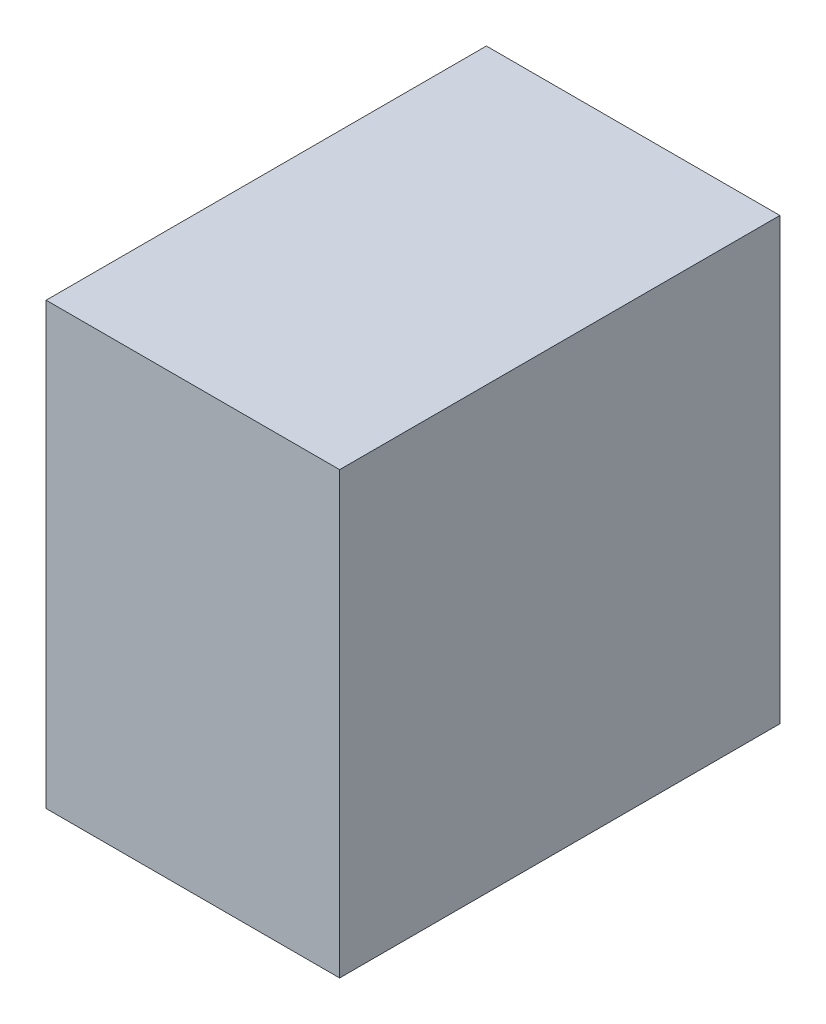
ISO-10303-21;
HEADER;
FILE_DESCRIPTION(('STEP AP214'),'2;1');
FILE_NAME('part.step','',(''),(''),'','','');
FILE_SCHEMA(('AUTOMOTIVE_DESIGN { 1 0 10303 214 1 1 1 1 }'));
ENDSEC;
DATA;
#1=APPLICATION_CONTEXT('core data for automotive mechanical design processes');
#2=APPLICATION_PROTOCOL_DEFINITION('international standard','automotive_design',2000,#1);
#3=PRODUCT_CONTEXT('',#1,'mechanical');
#4=PRODUCT('Part','Part','',(#3));
#5=PRODUCT_RELATED_PRODUCT_CATEGORY('part','',(#4));
#6=PRODUCT_DEFINITION_FORMATION('','',#4);
#7=PRODUCT_DEFINITION_CONTEXT('part definition',#1,'design');
#8=PRODUCT_DEFINITION('design','',#6,#7);
#9=PRODUCT_DEFINITION_SHAPE('','',#8);
#10=(LENGTH_UNIT() NAMED_UNIT(*) SI_UNIT(.MILLI.,.METRE.));
#11=(NAMED_UNIT(*) PLANE_ANGLE_UNIT() SI_UNIT($,.RADIAN.));
#12=(NAMED_UNIT(*) SI_UNIT($,.STERADIAN.) SOLID_ANGLE_UNIT());
#13=UNCERTAINTY_MEASURE_WITH_UNIT(LENGTH_MEASURE(1.E-05),#10,'distance_accuracy_value','');
#14=(GEOMETRIC_REPRESENTATION_CONTEXT(3) GLOBAL_UNCERTAINTY_ASSIGNED_CONTEXT((#13)) GLOBAL_UNIT_ASSIGNED_CONTEXT((#10,
#11,#12)) REPRESENTATION_CONTEXT('',''));
#15=CARTESIAN_POINT('',(0.,0.,0.));
#16=DIRECTION('',(0.,0.,1.));
#17=DIRECTION('',(1.,0.,0.));
#18=AXIS2_PLACEMENT_3D('',#15,#16,#17);
#19=CARTESIAN_POINT('',(10.,15.,15.));
#20=DIRECTION('',(0.,0.,-1.));
#21=DIRECTION('',(-1.,0.,0.));
#22=AXIS2_PLACEMENT_3D('',#19,#20,#21);
#23=PLANE('',#22);
#24=DIRECTION('',(0.,-1.,0.));
#25=VECTOR('',#24,1.);
#26=CARTESIAN_POINT('',(-10.,15.,15.));
#27=LINE('',#26,#25);
#28=CARTESIAN_POINT('',(-10.,15.,15.));
#29=VERTEX_POINT('',#28);
#30=CARTESIAN_POINT('',(-10.,-15.,15.));
#31=VERTEX_POINT('',#30);
#32=EDGE_CURVE('E95',#29,#31,#27,.T.);
#33=ORIENTED_EDGE('',*,*,#32,.T.);
#34=DIRECTION('',(-1.,0.,0.));
#35=VECTOR('',#34,1.);
#36=CARTESIAN_POINT('',(10.,-15.,15.));
#37=LINE('',#36,#35);
#38=CARTESIAN_POINT('',(10.,-15.,15.));
#39=VERTEX_POINT('',#38);
#40=EDGE_CURVE('E11',#39,#31,#37,.T.);
#41=ORIENTED_EDGE('',*,*,#40,.F.);
#42=DIRECTION('',(0.,-1.,0.));
#43=VECTOR('',#42,1.);
#44=CARTESIAN_POINT('',(10.,15.,15.));
#45=LINE('',#44,#43);
#46=CARTESIAN_POINT('',(10.,15.,15.));
#47=VERTEX_POINT('',#46);
#48=EDGE_CURVE('E83',#47,#39,#45,.T.);
#49=ORIENTED_EDGE('',*,*,#48,.F.);
#50=DIRECTION('',(-1.,0.,0.));
#51=VECTOR('',#50,1.);
#52=CARTESIAN_POINT('',(10.,15.,15.));
#53=LINE('',#52,#51);
#54=EDGE_CURVE('E91',#47,#29,#53,.T.);
#55=ORIENTED_EDGE('',*,*,#54,.T.);
#56=EDGE_LOOP('',(#33,#41,#49,#55));
#57=FACE_BOUND('',#56,.T.);
#58=ADVANCED_FACE('F32',(#57),#23,.F.);
#59=CARTESIAN_POINT('',(10.,-15.,15.));
#60=DIRECTION('',(0.,1.,0.));
#61=DIRECTION('',(0.,0.,1.));
#62=AXIS2_PLACEMENT_3D('',#59,#60,#61);
#63=PLANE('',#62);
#64=DIRECTION('',(0.,0.,-1.));
#65=VECTOR('',#64,1.);
#66=CARTESIAN_POINT('',(-10.,-15.,15.));
#67=LINE('',#66,#65);
#68=CARTESIAN_POINT('',(-10.,-15.,-15.));
#69=VERTEX_POINT('',#68);
#70=EDGE_CURVE('E87',#31,#69,#67,.T.);
#71=ORIENTED_EDGE('',*,*,#70,.T.);
#72=DIRECTION('',(-1.,0.,0.));
#73=VECTOR('',#72,1.);
#74=CARTESIAN_POINT('',(10.,-15.,-15.));
#75=LINE('',#74,#73);
#76=CARTESIAN_POINT('',(10.,-15.,-15.));
#77=VERTEX_POINT('',#76);
#78=EDGE_CURVE('E40',#77,#69,#75,.T.);
#79=ORIENTED_EDGE('',*,*,#78,.F.);
#80=DIRECTION('',(0.,0.,-1.));
#81=VECTOR('',#80,1.);
#82=CARTESIAN_POINT('',(10.,-15.,15.));
#83=LINE('',#82,#81);
#84=EDGE_CURVE('E78',#39,#77,#83,.T.);
#85=ORIENTED_EDGE('',*,*,#84,.F.);
#86=ORIENTED_EDGE('',*,*,#40,.T.);
#87=EDGE_LOOP('',(#71,#79,#85,#86));
#88=FACE_BOUND('',#87,.T.);
#89=ADVANCED_FACE('F86',(#88),#63,.F.);
#90=CARTESIAN_POINT('',(10.,15.,-15.));
#91=DIRECTION('',(0.,0.,1.));
#92=DIRECTION('',(1.,0.,0.));
#93=AXIS2_PLACEMENT_3D('',#90,#91,#92);
#94=PLANE('',#93);
#95=DIRECTION('',(0.,1.,0.));
#96=VECTOR('',#95,1.);
#97=CARTESIAN_POINT('',(-10.,15.,-15.));
#98=LINE('',#97,#96);
#99=CARTESIAN_POINT('',(-10.,15.,-15.));
#100=VERTEX_POINT('',#99);
#101=EDGE_CURVE('E65',#69,#100,#98,.T.);
#102=ORIENTED_EDGE('',*,*,#101,.T.);
#103=DIRECTION('',(-1.,0.,0.));
#104=VECTOR('',#103,1.);
#105=CARTESIAN_POINT('',(10.,15.,-15.));
#106=LINE('',#105,#104);
#107=CARTESIAN_POINT('',(10.,15.,-15.));
#108=VERTEX_POINT('',#107);
#109=EDGE_CURVE('E88',#108,#100,#106,.T.);
#110=ORIENTED_EDGE('',*,*,#109,.F.);
#111=DIRECTION('',(0.,1.,0.));
#112=VECTOR('',#111,1.);
#113=CARTESIAN_POINT('',(10.,15.,-15.));
#114=LINE('',#113,#112);
#115=EDGE_CURVE('E81',#77,#108,#114,.T.);
#116=ORIENTED_EDGE('',*,*,#115,.F.);
#117=ORIENTED_EDGE('',*,*,#78,.T.);
#118=EDGE_LOOP('',(#102,#110,#116,#117));
#119=FACE_BOUND('',#118,.T.);
#120=ADVANCED_FACE('F89',(#119),#94,.F.);
#121=CARTESIAN_POINT('',(10.,15.,15.));
#122=DIRECTION('',(0.,-1.,0.));
#123=DIRECTION('',(0.,0.,-1.));
#124=AXIS2_PLACEMENT_3D('',#121,#122,#123);
#125=PLANE('',#124);
#126=DIRECTION('',(0.,0.,1.));
#127=VECTOR('',#126,1.);
#128=CARTESIAN_POINT('',(-10.,15.,15.));
#129=LINE('',#128,#127);
#130=EDGE_CURVE('E71',#100,#29,#129,.T.);
#131=ORIENTED_EDGE('',*,*,#130,.T.);
#132=ORIENTED_EDGE('',*,*,#54,.F.);
#133=DIRECTION('',(0.,0.,1.));
#134=VECTOR('',#133,1.);
#135=CARTESIAN_POINT('',(10.,15.,15.));
#136=LINE('',#135,#134);
#137=EDGE_CURVE('E48',#108,#47,#136,.T.);
#138=ORIENTED_EDGE('',*,*,#137,.F.);
#139=ORIENTED_EDGE('',*,*,#109,.T.);
#140=EDGE_LOOP('',(#131,#132,#138,#139));
#141=FACE_BOUND('',#140,.T.);
#142=ADVANCED_FACE('F102',(#141),#125,.F.);
#143=CARTESIAN_POINT('',(10.,0.,0.));
#144=DIRECTION('',(1.,0.,0.));
#145=DIRECTION('',(0.,0.,-1.));
#146=AXIS2_PLACEMENT_3D('',#143,#144,#145);
#147=PLANE('',#146);
#148=ORIENTED_EDGE('',*,*,#48,.T.);
#149=ORIENTED_EDGE('',*,*,#84,.T.);
#150=ORIENTED_EDGE('',*,*,#115,.T.);
#151=ORIENTED_EDGE('',*,*,#137,.T.);
#152=EDGE_LOOP('',(#148,#149,#150,#151));
#153=FACE_BOUND('',#152,.T.);
#154=ADVANCED_FACE('F79',(#153),#147,.T.);
#155=CARTESIAN_POINT('',(-10.,0.,0.));
#156=DIRECTION('',(1.,0.,0.));
#157=DIRECTION('',(0.,0.,-1.));
#158=AXIS2_PLACEMENT_3D('',#155,#156,#157);
#159=PLANE('',#158);
#160=ORIENTED_EDGE('',*,*,#32,.F.);
#161=ORIENTED_EDGE('',*,*,#130,.F.);
#162=ORIENTED_EDGE('',*,*,#101,.F.);
#163=ORIENTED_EDGE('',*,*,#70,.F.);
#164=EDGE_LOOP('',(#160,#161,#162,#163));
#165=FACE_BOUND('',#164,.T.);
#166=ADVANCED_FACE('F105',(#165),#159,.F.);
#167=CLOSED_SHELL('',(#58,#89,#120,#142,#154,#166));
#168=MANIFOLD_SOLID_BREP('B2',#167);
#169=ADVANCED_BREP_SHAPE_REPRESENTATION('',(#18,#168),#14);
#170=SHAPE_DEFINITION_REPRESENTATION(#9,#169);
ENDSEC;
END-ISO-10303-21;
